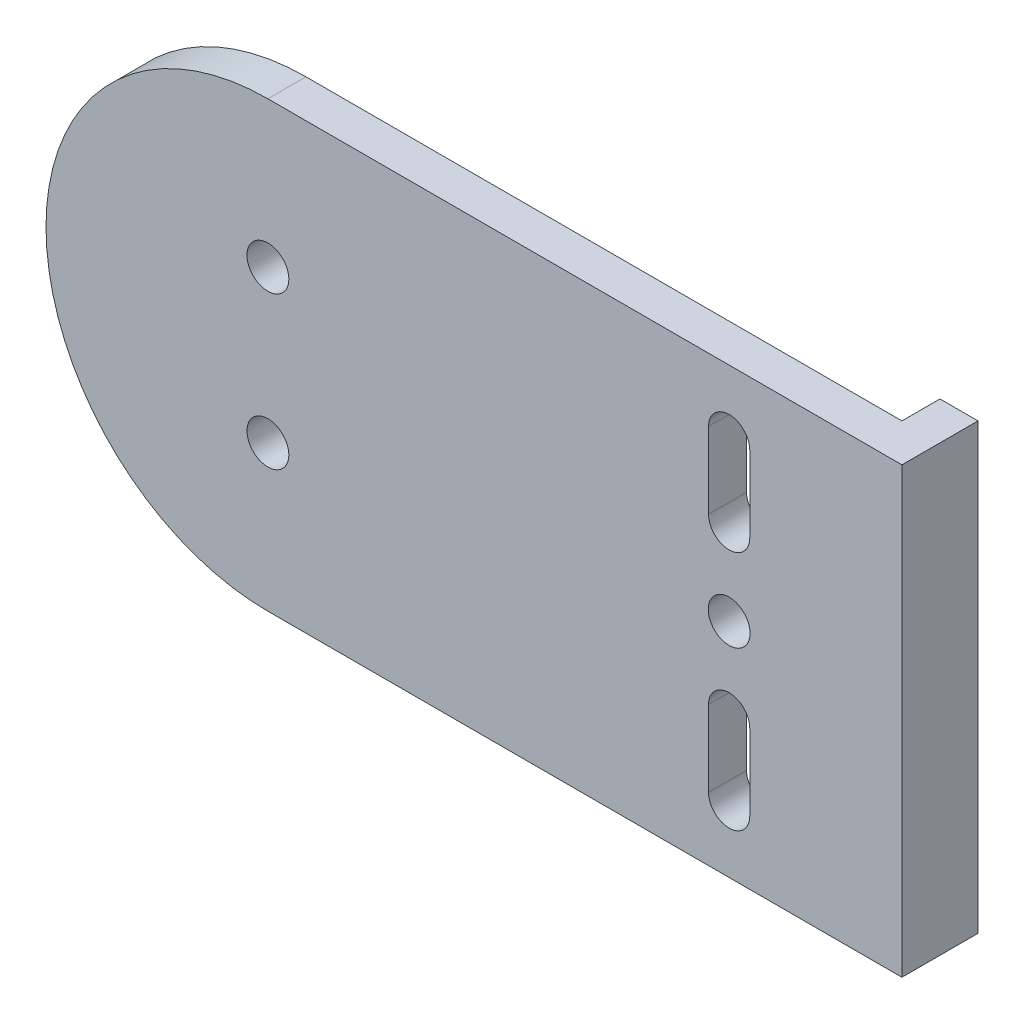
ISO-10303-21;
HEADER;
FILE_DESCRIPTION(('STEP AP214'),'2;1');
FILE_NAME('part.step','',(''),(''),'','','');
FILE_SCHEMA(('AUTOMOTIVE_DESIGN { 1 0 10303 214 1 1 1 1 }'));
ENDSEC;
DATA;
#1=APPLICATION_CONTEXT('core data for automotive mechanical design processes');
#2=APPLICATION_PROTOCOL_DEFINITION('international standard','automotive_design',2000,#1);
#3=PRODUCT_CONTEXT('',#1,'mechanical');
#4=PRODUCT('Part','Part','',(#3));
#5=PRODUCT_RELATED_PRODUCT_CATEGORY('part','',(#4));
#6=PRODUCT_DEFINITION_FORMATION('','',#4);
#7=PRODUCT_DEFINITION_CONTEXT('part definition',#1,'design');
#8=PRODUCT_DEFINITION('design','',#6,#7);
#9=PRODUCT_DEFINITION_SHAPE('','',#8);
#10=(LENGTH_UNIT() NAMED_UNIT(*) SI_UNIT(.MILLI.,.METRE.));
#11=(NAMED_UNIT(*) PLANE_ANGLE_UNIT() SI_UNIT($,.RADIAN.));
#12=(NAMED_UNIT(*) SI_UNIT($,.STERADIAN.) SOLID_ANGLE_UNIT());
#13=UNCERTAINTY_MEASURE_WITH_UNIT(LENGTH_MEASURE(1.E-05),#10,'distance_accuracy_value','');
#14=(GEOMETRIC_REPRESENTATION_CONTEXT(3) GLOBAL_UNCERTAINTY_ASSIGNED_CONTEXT((#13)) GLOBAL_UNIT_ASSIGNED_CONTEXT((#10,
#11,#12)) REPRESENTATION_CONTEXT('',''));
#15=CARTESIAN_POINT('',(0.,0.,0.));
#16=DIRECTION('',(0.,0.,1.));
#17=DIRECTION('',(1.,0.,0.));
#18=AXIS2_PLACEMENT_3D('',#15,#16,#17);
#19=CARTESIAN_POINT('',(0.,0.,3.));
#20=DIRECTION('',(0.,0.,1.));
#21=DIRECTION('',(1.,0.,0.));
#22=AXIS2_PLACEMENT_3D('',#19,#20,#21);
#23=PLANE('',#22);
#24=DIRECTION('',(1.,0.,0.));
#25=VECTOR('',#24,1.);
#26=CARTESIAN_POINT('',(50.,-17.5,3.));
#27=LINE('',#26,#25);
#28=CARTESIAN_POINT('',(0.,-17.5,3.));
#29=VERTEX_POINT('',#28);
#30=CARTESIAN_POINT('',(50.,-17.5,3.));
#31=VERTEX_POINT('',#30);
#32=EDGE_CURVE('E250',#29,#31,#27,.T.);
#33=ORIENTED_EDGE('',*,*,#32,.T.);
#34=DIRECTION('',(0.,1.,0.));
#35=VECTOR('',#34,1.);
#36=CARTESIAN_POINT('',(50.,17.5,3.));
#37=LINE('',#36,#35);
#38=CARTESIAN_POINT('',(50.,17.5,3.));
#39=VERTEX_POINT('',#38);
#40=EDGE_CURVE('E253',#31,#39,#37,.T.);
#41=ORIENTED_EDGE('',*,*,#40,.T.);
#42=DIRECTION('',(-1.,0.,0.));
#43=VECTOR('',#42,1.);
#44=CARTESIAN_POINT('',(0.,17.5,3.));
#45=LINE('',#44,#43);
#46=CARTESIAN_POINT('',(0.,17.5,3.));
#47=VERTEX_POINT('',#46);
#48=EDGE_CURVE('E139',#39,#47,#45,.T.);
#49=ORIENTED_EDGE('',*,*,#48,.T.);
#50=CARTESIAN_POINT('',(0.,0.,3.));
#51=DIRECTION('',(0.,0.,1.));
#52=DIRECTION('',(1.,0.,0.));
#53=AXIS2_PLACEMENT_3D('',#50,#51,#52);
#54=CIRCLE('',#53,17.5);
#55=EDGE_CURVE('E247',#47,#29,#54,.T.);
#56=ORIENTED_EDGE('',*,*,#55,.T.);
#57=EDGE_LOOP('',(#33,#41,#49,#56));
#58=FACE_BOUND('',#57,.T.);
#59=CARTESIAN_POINT('',(0.,6.,3.));
#60=DIRECTION('',(0.,0.,1.));
#61=DIRECTION('',(1.,0.,0.));
#62=AXIS2_PLACEMENT_3D('',#59,#60,#61);
#63=CIRCLE('',#62,1.65);
#64=CARTESIAN_POINT('',(1.65,6.,3.));
#65=VERTEX_POINT('',#64);
#66=EDGE_CURVE('E175',#65,#65,#63,.T.);
#67=ORIENTED_EDGE('',*,*,#66,.F.);
#68=EDGE_LOOP('',(#67));
#69=FACE_BOUND('',#68,.T.);
#70=DIRECTION('',(0.,-1.,0.));
#71=VECTOR('',#70,1.);
#72=CARTESIAN_POINT('',(34.75,-6.5,3.));
#73=LINE('',#72,#71);
#74=CARTESIAN_POINT('',(34.75,-6.5,3.));
#75=VERTEX_POINT('',#74);
#76=CARTESIAN_POINT('',(34.75,-12.5,3.));
#77=VERTEX_POINT('',#76);
#78=EDGE_CURVE('E189',#75,#77,#73,.T.);
#79=ORIENTED_EDGE('',*,*,#78,.F.);
#80=CARTESIAN_POINT('',(36.375,-6.5,3.));
#81=DIRECTION('',(0.,0.,1.));
#82=DIRECTION('',(1.,0.,0.));
#83=AXIS2_PLACEMENT_3D('',#80,#81,#82);
#84=CIRCLE('',#83,1.62499999999999);
#85=CARTESIAN_POINT('',(38.,-6.5,3.));
#86=VERTEX_POINT('',#85);
#87=EDGE_CURVE('E187',#86,#75,#84,.T.);
#88=ORIENTED_EDGE('',*,*,#87,.F.);
#89=DIRECTION('',(0.,1.,0.));
#90=VECTOR('',#89,1.);
#91=CARTESIAN_POINT('',(38.,-12.5,3.));
#92=LINE('',#91,#90);
#93=CARTESIAN_POINT('',(38.,-12.5,3.));
#94=VERTEX_POINT('',#93);
#95=EDGE_CURVE('E194',#94,#86,#92,.T.);
#96=ORIENTED_EDGE('',*,*,#95,.F.);
#97=CARTESIAN_POINT('',(36.375,-12.5,3.));
#98=DIRECTION('',(0.,0.,1.));
#99=DIRECTION('',(1.,0.,0.));
#100=AXIS2_PLACEMENT_3D('',#97,#98,#99);
#101=CIRCLE('',#100,1.625);
#102=EDGE_CURVE('E192',#77,#94,#101,.T.);
#103=ORIENTED_EDGE('',*,*,#102,.F.);
#104=EDGE_LOOP('',(#79,#88,#96,#103));
#105=FACE_BOUND('',#104,.T.);
#106=DIRECTION('',(0.,-1.,0.));
#107=VECTOR('',#106,1.);
#108=CARTESIAN_POINT('',(34.75,12.5,3.));
#109=LINE('',#108,#107);
#110=CARTESIAN_POINT('',(34.75,12.5,3.));
#111=VERTEX_POINT('',#110);
#112=CARTESIAN_POINT('',(34.75,6.49999999999999,3.));
#113=VERTEX_POINT('',#112);
#114=EDGE_CURVE('E218',#111,#113,#109,.T.);
#115=ORIENTED_EDGE('',*,*,#114,.F.);
#116=CARTESIAN_POINT('',(36.375,12.5,3.));
#117=DIRECTION('',(0.,0.,1.));
#118=DIRECTION('',(1.,0.,0.));
#119=AXIS2_PLACEMENT_3D('',#116,#117,#118);
#120=CIRCLE('',#119,1.625);
#121=CARTESIAN_POINT('',(38.,12.5,3.));
#122=VERTEX_POINT('',#121);
#123=EDGE_CURVE('E216',#122,#111,#120,.T.);
#124=ORIENTED_EDGE('',*,*,#123,.F.);
#125=DIRECTION('',(0.,1.,0.));
#126=VECTOR('',#125,1.);
#127=CARTESIAN_POINT('',(38.,6.49999999999999,3.));
#128=LINE('',#127,#126);
#129=CARTESIAN_POINT('',(38.,6.49999999999999,3.));
#130=VERTEX_POINT('',#129);
#131=EDGE_CURVE('E224',#130,#122,#128,.T.);
#132=ORIENTED_EDGE('',*,*,#131,.F.);
#133=CARTESIAN_POINT('',(36.375,6.49999999999999,3.));
#134=DIRECTION('',(0.,0.,1.));
#135=DIRECTION('',(1.,0.,0.));
#136=AXIS2_PLACEMENT_3D('',#133,#134,#135);
#137=CIRCLE('',#136,1.625);
#138=EDGE_CURVE('E221',#113,#130,#137,.T.);
#139=ORIENTED_EDGE('',*,*,#138,.F.);
#140=EDGE_LOOP('',(#115,#124,#132,#139));
#141=FACE_BOUND('',#140,.T.);
#142=CARTESIAN_POINT('',(36.375,0.,3.));
#143=DIRECTION('',(0.,0.,1.));
#144=DIRECTION('',(1.,0.,0.));
#145=AXIS2_PLACEMENT_3D('',#142,#143,#144);
#146=CIRCLE('',#145,1.65);
#147=CARTESIAN_POINT('',(38.025,0.,3.));
#148=VERTEX_POINT('',#147);
#149=EDGE_CURVE('E181',#148,#148,#146,.T.);
#150=ORIENTED_EDGE('',*,*,#149,.F.);
#151=EDGE_LOOP('',(#150));
#152=FACE_BOUND('',#151,.T.);
#153=CARTESIAN_POINT('',(0.,-6.,3.));
#154=DIRECTION('',(0.,0.,1.));
#155=DIRECTION('',(1.,0.,0.));
#156=AXIS2_PLACEMENT_3D('',#153,#154,#155);
#157=CIRCLE('',#156,1.65);
#158=CARTESIAN_POINT('',(1.65,-6.,3.));
#159=VERTEX_POINT('',#158);
#160=EDGE_CURVE('E169',#159,#159,#157,.T.);
#161=ORIENTED_EDGE('',*,*,#160,.F.);
#162=EDGE_LOOP('',(#161));
#163=FACE_BOUND('',#162,.T.);
#164=ADVANCED_FACE('F34',(#58,#69,#105,#141,#152,#163),#23,.T.);
#165=CARTESIAN_POINT('',(0.,0.,0.));
#166=DIRECTION('',(0.,0.,1.));
#167=DIRECTION('',(1.,0.,0.));
#168=AXIS2_PLACEMENT_3D('',#165,#166,#167);
#169=PLANE('',#168);
#170=CARTESIAN_POINT('',(36.375,12.5,0.));
#171=DIRECTION('',(0.,0.,1.));
#172=DIRECTION('',(1.,0.,0.));
#173=AXIS2_PLACEMENT_3D('',#170,#171,#172);
#174=CIRCLE('',#173,1.625);
#175=CARTESIAN_POINT('',(38.,12.5,0.));
#176=VERTEX_POINT('',#175);
#177=CARTESIAN_POINT('',(34.75,12.5,0.));
#178=VERTEX_POINT('',#177);
#179=EDGE_CURVE('E215',#176,#178,#174,.T.);
#180=ORIENTED_EDGE('',*,*,#179,.T.);
#181=DIRECTION('',(0.,-1.,0.));
#182=VECTOR('',#181,1.);
#183=CARTESIAN_POINT('',(34.75,12.5,0.));
#184=LINE('',#183,#182);
#185=CARTESIAN_POINT('',(34.75,6.49999999999999,0.));
#186=VERTEX_POINT('',#185);
#187=EDGE_CURVE('E229',#178,#186,#184,.T.);
#188=ORIENTED_EDGE('',*,*,#187,.T.);
#189=CARTESIAN_POINT('',(36.375,6.49999999999999,0.));
#190=DIRECTION('',(0.,0.,1.));
#191=DIRECTION('',(1.,0.,0.));
#192=AXIS2_PLACEMENT_3D('',#189,#190,#191);
#193=CIRCLE('',#192,1.625);
#194=CARTESIAN_POINT('',(38.,6.49999999999999,0.));
#195=VERTEX_POINT('',#194);
#196=EDGE_CURVE('E232',#186,#195,#193,.T.);
#197=ORIENTED_EDGE('',*,*,#196,.T.);
#198=DIRECTION('',(0.,1.,0.));
#199=VECTOR('',#198,1.);
#200=CARTESIAN_POINT('',(38.,6.49999999999999,0.));
#201=LINE('',#200,#199);
#202=EDGE_CURVE('E219',#195,#176,#201,.T.);
#203=ORIENTED_EDGE('',*,*,#202,.T.);
#204=EDGE_LOOP('',(#180,#188,#197,#203));
#205=FACE_BOUND('',#204,.T.);
#206=DIRECTION('',(-1.,0.,0.));
#207=VECTOR('',#206,1.);
#208=CARTESIAN_POINT('',(0.,17.5,0.));
#209=LINE('',#208,#207);
#210=CARTESIAN_POINT('',(47.,17.5,0.));
#211=VERTEX_POINT('',#210);
#212=CARTESIAN_POINT('',(0.,17.5,0.));
#213=VERTEX_POINT('',#212);
#214=EDGE_CURVE('E251',#211,#213,#209,.T.);
#215=ORIENTED_EDGE('',*,*,#214,.F.);
#216=DIRECTION('',(0.,-1.,0.));
#217=VECTOR('',#216,1.);
#218=CARTESIAN_POINT('',(47.,0.,0.));
#219=LINE('',#218,#217);
#220=CARTESIAN_POINT('',(47.,-17.5,0.));
#221=VERTEX_POINT('',#220);
#222=EDGE_CURVE('E164',#211,#221,#219,.T.);
#223=ORIENTED_EDGE('',*,*,#222,.T.);
#224=DIRECTION('',(1.,0.,0.));
#225=VECTOR('',#224,1.);
#226=CARTESIAN_POINT('',(50.,-17.5,0.));
#227=LINE('',#226,#225);
#228=CARTESIAN_POINT('',(0.,-17.5,0.));
#229=VERTEX_POINT('',#228);
#230=EDGE_CURVE('E258',#229,#221,#227,.T.);
#231=ORIENTED_EDGE('',*,*,#230,.F.);
#232=CARTESIAN_POINT('',(0.,0.,0.));
#233=DIRECTION('',(0.,0.,1.));
#234=DIRECTION('',(1.,0.,0.));
#235=AXIS2_PLACEMENT_3D('',#232,#233,#234);
#236=CIRCLE('',#235,17.5);
#237=EDGE_CURVE('E246',#213,#229,#236,.T.);
#238=ORIENTED_EDGE('',*,*,#237,.F.);
#239=EDGE_LOOP('',(#215,#223,#231,#238));
#240=FACE_BOUND('',#239,.T.);
#241=CARTESIAN_POINT('',(36.375,-6.5,0.));
#242=DIRECTION('',(0.,0.,1.));
#243=DIRECTION('',(1.,0.,0.));
#244=AXIS2_PLACEMENT_3D('',#241,#242,#243);
#245=CIRCLE('',#244,1.62499999999999);
#246=CARTESIAN_POINT('',(38.,-6.5,0.));
#247=VERTEX_POINT('',#246);
#248=CARTESIAN_POINT('',(34.75,-6.5,0.));
#249=VERTEX_POINT('',#248);
#250=EDGE_CURVE('E184',#247,#249,#245,.T.);
#251=ORIENTED_EDGE('',*,*,#250,.T.);
#252=DIRECTION('',(0.,-1.,0.));
#253=VECTOR('',#252,1.);
#254=CARTESIAN_POINT('',(34.75,-6.5,0.));
#255=LINE('',#254,#253);
#256=CARTESIAN_POINT('',(34.75,-12.5,0.));
#257=VERTEX_POINT('',#256);
#258=EDGE_CURVE('E199',#249,#257,#255,.T.);
#259=ORIENTED_EDGE('',*,*,#258,.T.);
#260=CARTESIAN_POINT('',(36.375,-12.5,0.));
#261=DIRECTION('',(0.,0.,1.));
#262=DIRECTION('',(1.,0.,0.));
#263=AXIS2_PLACEMENT_3D('',#260,#261,#262);
#264=CIRCLE('',#263,1.625);
#265=CARTESIAN_POINT('',(38.,-12.5,0.));
#266=VERTEX_POINT('',#265);
#267=EDGE_CURVE('E202',#257,#266,#264,.T.);
#268=ORIENTED_EDGE('',*,*,#267,.T.);
#269=DIRECTION('',(0.,1.,0.));
#270=VECTOR('',#269,1.);
#271=CARTESIAN_POINT('',(38.,-12.5,0.));
#272=LINE('',#271,#270);
#273=EDGE_CURVE('E190',#266,#247,#272,.T.);
#274=ORIENTED_EDGE('',*,*,#273,.T.);
#275=EDGE_LOOP('',(#251,#259,#268,#274));
#276=FACE_BOUND('',#275,.T.);
#277=CARTESIAN_POINT('',(36.375,0.,0.));
#278=DIRECTION('',(0.,0.,1.));
#279=DIRECTION('',(1.,0.,0.));
#280=AXIS2_PLACEMENT_3D('',#277,#278,#279);
#281=CIRCLE('',#280,1.65);
#282=CARTESIAN_POINT('',(38.025,0.,0.));
#283=VERTEX_POINT('',#282);
#284=EDGE_CURVE('E178',#283,#283,#281,.T.);
#285=ORIENTED_EDGE('',*,*,#284,.T.);
#286=EDGE_LOOP('',(#285));
#287=FACE_BOUND('',#286,.T.);
#288=CARTESIAN_POINT('',(0.,6.,0.));
#289=DIRECTION('',(0.,0.,1.));
#290=DIRECTION('',(1.,0.,0.));
#291=AXIS2_PLACEMENT_3D('',#288,#289,#290);
#292=CIRCLE('',#291,1.65);
#293=CARTESIAN_POINT('',(1.65,6.,0.));
#294=VERTEX_POINT('',#293);
#295=EDGE_CURVE('E172',#294,#294,#292,.T.);
#296=ORIENTED_EDGE('',*,*,#295,.T.);
#297=EDGE_LOOP('',(#296));
#298=FACE_BOUND('',#297,.T.);
#299=CARTESIAN_POINT('',(0.,-6.,0.));
#300=DIRECTION('',(0.,0.,1.));
#301=DIRECTION('',(1.,0.,0.));
#302=AXIS2_PLACEMENT_3D('',#299,#300,#301);
#303=CIRCLE('',#302,1.65);
#304=CARTESIAN_POINT('',(1.65,-6.,0.));
#305=VERTEX_POINT('',#304);
#306=EDGE_CURVE('E168',#305,#305,#303,.T.);
#307=ORIENTED_EDGE('',*,*,#306,.T.);
#308=EDGE_LOOP('',(#307));
#309=FACE_BOUND('',#308,.T.);
#310=ADVANCED_FACE('F269',(#205,#240,#276,#287,#298,#309),#169,.F.);
#311=CARTESIAN_POINT('',(0.,0.,3.));
#312=DIRECTION('',(0.,0.,-1.));
#313=DIRECTION('',(-1.,0.,0.));
#314=AXIS2_PLACEMENT_3D('',#311,#312,#313);
#315=CYLINDRICAL_SURFACE('',#314,17.5);
#316=ORIENTED_EDGE('',*,*,#237,.T.);
#317=DIRECTION('',(0.,0.,-1.));
#318=VECTOR('',#317,1.);
#319=CARTESIAN_POINT('',(0.,-17.5,3.));
#320=LINE('',#319,#318);
#321=EDGE_CURVE('E11',#29,#229,#320,.T.);
#322=ORIENTED_EDGE('',*,*,#321,.F.);
#323=ORIENTED_EDGE('',*,*,#55,.F.);
#324=DIRECTION('',(0.,0.,-1.));
#325=VECTOR('',#324,1.);
#326=CARTESIAN_POINT('',(0.,17.5,3.));
#327=LINE('',#326,#325);
#328=EDGE_CURVE('E143',#47,#213,#327,.T.);
#329=ORIENTED_EDGE('',*,*,#328,.T.);
#330=EDGE_LOOP('',(#316,#322,#323,#329));
#331=FACE_BOUND('',#330,.T.);
#332=ADVANCED_FACE('F36',(#331),#315,.T.);
#333=CARTESIAN_POINT('',(50.,-17.5,3.));
#334=DIRECTION('',(0.,1.,0.));
#335=DIRECTION('',(-1.,0.,0.));
#336=AXIS2_PLACEMENT_3D('',#333,#334,#335);
#337=PLANE('',#336);
#338=ORIENTED_EDGE('',*,*,#230,.T.);
#339=DIRECTION('',(0.,0.,1.));
#340=VECTOR('',#339,1.);
#341=CARTESIAN_POINT('',(47.,-17.5,-3.));
#342=LINE('',#341,#340);
#343=CARTESIAN_POINT('',(47.,-17.5,-3.));
#344=VERTEX_POINT('',#343);
#345=EDGE_CURVE('E162',#344,#221,#342,.T.);
#346=ORIENTED_EDGE('',*,*,#345,.F.);
#347=DIRECTION('',(1.,0.,0.));
#348=VECTOR('',#347,1.);
#349=CARTESIAN_POINT('',(50.,-17.5,-3.));
#350=LINE('',#349,#348);
#351=CARTESIAN_POINT('',(50.,-17.5,-3.));
#352=VERTEX_POINT('',#351);
#353=EDGE_CURVE('E160',#344,#352,#350,.T.);
#354=ORIENTED_EDGE('',*,*,#353,.T.);
#355=DIRECTION('',(0.,0.,-1.));
#356=VECTOR('',#355,1.);
#357=CARTESIAN_POINT('',(50.,-17.5,3.));
#358=LINE('',#357,#356);
#359=EDGE_CURVE('E42',#31,#352,#358,.T.);
#360=ORIENTED_EDGE('',*,*,#359,.F.);
#361=ORIENTED_EDGE('',*,*,#32,.F.);
#362=ORIENTED_EDGE('',*,*,#321,.T.);
#363=EDGE_LOOP('',(#338,#346,#354,#360,#361,#362));
#364=FACE_BOUND('',#363,.T.);
#365=ADVANCED_FACE('F272',(#364),#337,.F.);
#366=CARTESIAN_POINT('',(50.,17.5,3.));
#367=DIRECTION('',(-1.,0.,0.));
#368=DIRECTION('',(0.,0.,1.));
#369=AXIS2_PLACEMENT_3D('',#366,#367,#368);
#370=PLANE('',#369);
#371=ORIENTED_EDGE('',*,*,#359,.T.);
#372=DIRECTION('',(0.,1.,0.));
#373=VECTOR('',#372,1.);
#374=CARTESIAN_POINT('',(50.,17.5,-3.));
#375=LINE('',#374,#373);
#376=CARTESIAN_POINT('',(50.,17.5,-3.));
#377=VERTEX_POINT('',#376);
#378=EDGE_CURVE('E150',#352,#377,#375,.T.);
#379=ORIENTED_EDGE('',*,*,#378,.T.);
#380=DIRECTION('',(0.,0.,-1.));
#381=VECTOR('',#380,1.);
#382=CARTESIAN_POINT('',(50.,17.5,3.));
#383=LINE('',#382,#381);
#384=EDGE_CURVE('E134',#39,#377,#383,.T.);
#385=ORIENTED_EDGE('',*,*,#384,.F.);
#386=ORIENTED_EDGE('',*,*,#40,.F.);
#387=EDGE_LOOP('',(#371,#379,#385,#386));
#388=FACE_BOUND('',#387,.T.);
#389=ADVANCED_FACE('F155',(#388),#370,.F.);
#390=CARTESIAN_POINT('',(0.,17.5,3.));
#391=DIRECTION('',(0.,-1.,0.));
#392=DIRECTION('',(1.,0.,0.));
#393=AXIS2_PLACEMENT_3D('',#390,#391,#392);
#394=PLANE('',#393);
#395=ORIENTED_EDGE('',*,*,#328,.F.);
#396=ORIENTED_EDGE('',*,*,#48,.F.);
#397=ORIENTED_EDGE('',*,*,#384,.T.);
#398=DIRECTION('',(-1.,0.,0.));
#399=VECTOR('',#398,1.);
#400=CARTESIAN_POINT('',(50.,17.5,-3.));
#401=LINE('',#400,#399);
#402=CARTESIAN_POINT('',(47.,17.5,-3.));
#403=VERTEX_POINT('',#402);
#404=EDGE_CURVE('E138',#377,#403,#401,.T.);
#405=ORIENTED_EDGE('',*,*,#404,.T.);
#406=DIRECTION('',(0.,0.,1.));
#407=VECTOR('',#406,1.);
#408=CARTESIAN_POINT('',(47.,17.5,-3.));
#409=LINE('',#408,#407);
#410=EDGE_CURVE('E49',#403,#211,#409,.T.);
#411=ORIENTED_EDGE('',*,*,#410,.T.);
#412=ORIENTED_EDGE('',*,*,#214,.T.);
#413=EDGE_LOOP('',(#395,#396,#397,#405,#411,#412));
#414=FACE_BOUND('',#413,.T.);
#415=ADVANCED_FACE('F137',(#414),#394,.F.);
#416=CARTESIAN_POINT('',(36.375,12.5,3.));
#417=DIRECTION('',(0.,0.,-1.));
#418=DIRECTION('',(-1.,0.,0.));
#419=AXIS2_PLACEMENT_3D('',#416,#417,#418);
#420=CYLINDRICAL_SURFACE('',#419,1.625);
#421=ORIENTED_EDGE('',*,*,#179,.F.);
#422=DIRECTION('',(0.,0.,-1.));
#423=VECTOR('',#422,1.);
#424=CARTESIAN_POINT('',(38.,12.5,3.));
#425=LINE('',#424,#423);
#426=EDGE_CURVE('E226',#122,#176,#425,.T.);
#427=ORIENTED_EDGE('',*,*,#426,.F.);
#428=ORIENTED_EDGE('',*,*,#123,.T.);
#429=DIRECTION('',(0.,0.,-1.));
#430=VECTOR('',#429,1.);
#431=CARTESIAN_POINT('',(34.75,12.5,3.));
#432=LINE('',#431,#430);
#433=EDGE_CURVE('E243',#111,#178,#432,.T.);
#434=ORIENTED_EDGE('',*,*,#433,.T.);
#435=EDGE_LOOP('',(#421,#427,#428,#434));
#436=FACE_BOUND('',#435,.T.);
#437=ADVANCED_FACE('F309',(#436),#420,.F.);
#438=CARTESIAN_POINT('',(34.75,12.5,3.));
#439=DIRECTION('',(1.,0.,0.));
#440=DIRECTION('',(0.,1.,0.));
#441=AXIS2_PLACEMENT_3D('',#438,#439,#440);
#442=PLANE('',#441);
#443=ORIENTED_EDGE('',*,*,#187,.F.);
#444=ORIENTED_EDGE('',*,*,#433,.F.);
#445=ORIENTED_EDGE('',*,*,#114,.T.);
#446=DIRECTION('',(0.,0.,-1.));
#447=VECTOR('',#446,1.);
#448=CARTESIAN_POINT('',(34.75,6.49999999999999,3.));
#449=LINE('',#448,#447);
#450=EDGE_CURVE('E241',#113,#186,#449,.T.);
#451=ORIENTED_EDGE('',*,*,#450,.T.);
#452=EDGE_LOOP('',(#443,#444,#445,#451));
#453=FACE_BOUND('',#452,.T.);
#454=ADVANCED_FACE('F331',(#453),#442,.T.);
#455=CARTESIAN_POINT('',(36.375,6.49999999999999,3.));
#456=DIRECTION('',(0.,0.,-1.));
#457=DIRECTION('',(-1.,0.,0.));
#458=AXIS2_PLACEMENT_3D('',#455,#456,#457);
#459=CYLINDRICAL_SURFACE('',#458,1.625);
#460=ORIENTED_EDGE('',*,*,#196,.F.);
#461=ORIENTED_EDGE('',*,*,#450,.F.);
#462=ORIENTED_EDGE('',*,*,#138,.T.);
#463=DIRECTION('',(0.,0.,-1.));
#464=VECTOR('',#463,1.);
#465=CARTESIAN_POINT('',(38.,6.49999999999999,3.));
#466=LINE('',#465,#464);
#467=EDGE_CURVE('E239',#130,#195,#466,.T.);
#468=ORIENTED_EDGE('',*,*,#467,.T.);
#469=EDGE_LOOP('',(#460,#461,#462,#468));
#470=FACE_BOUND('',#469,.T.);
#471=ADVANCED_FACE('F338',(#470),#459,.F.);
#472=CARTESIAN_POINT('',(38.,6.49999999999999,3.));
#473=DIRECTION('',(-1.,0.,0.));
#474=DIRECTION('',(0.,0.,1.));
#475=AXIS2_PLACEMENT_3D('',#472,#473,#474);
#476=PLANE('',#475);
#477=ORIENTED_EDGE('',*,*,#202,.F.);
#478=ORIENTED_EDGE('',*,*,#467,.F.);
#479=ORIENTED_EDGE('',*,*,#131,.T.);
#480=ORIENTED_EDGE('',*,*,#426,.T.);
#481=EDGE_LOOP('',(#477,#478,#479,#480));
#482=FACE_BOUND('',#481,.T.);
#483=ADVANCED_FACE('F346',(#482),#476,.T.);
#484=CARTESIAN_POINT('',(36.375,-6.5,3.));
#485=DIRECTION('',(0.,0.,-1.));
#486=DIRECTION('',(-1.,0.,0.));
#487=AXIS2_PLACEMENT_3D('',#484,#485,#486);
#488=CYLINDRICAL_SURFACE('',#487,1.62499999999999);
#489=ORIENTED_EDGE('',*,*,#250,.F.);
#490=DIRECTION('',(0.,0.,-1.));
#491=VECTOR('',#490,1.);
#492=CARTESIAN_POINT('',(38.,-6.5,3.));
#493=LINE('',#492,#491);
#494=EDGE_CURVE('E196',#86,#247,#493,.T.);
#495=ORIENTED_EDGE('',*,*,#494,.F.);
#496=ORIENTED_EDGE('',*,*,#87,.T.);
#497=DIRECTION('',(0.,0.,-1.));
#498=VECTOR('',#497,1.);
#499=CARTESIAN_POINT('',(34.75,-6.5,3.));
#500=LINE('',#499,#498);
#501=EDGE_CURVE('E212',#75,#249,#500,.T.);
#502=ORIENTED_EDGE('',*,*,#501,.T.);
#503=EDGE_LOOP('',(#489,#495,#496,#502));
#504=FACE_BOUND('',#503,.T.);
#505=ADVANCED_FACE('F354',(#504),#488,.F.);
#506=CARTESIAN_POINT('',(34.75,-6.5,3.));
#507=DIRECTION('',(1.,0.,0.));
#508=DIRECTION('',(0.,1.,0.));
#509=AXIS2_PLACEMENT_3D('',#506,#507,#508);
#510=PLANE('',#509);
#511=ORIENTED_EDGE('',*,*,#258,.F.);
#512=ORIENTED_EDGE('',*,*,#501,.F.);
#513=ORIENTED_EDGE('',*,*,#78,.T.);
#514=DIRECTION('',(0.,0.,-1.));
#515=VECTOR('',#514,1.);
#516=CARTESIAN_POINT('',(34.75,-12.5,3.));
#517=LINE('',#516,#515);
#518=EDGE_CURVE('E210',#77,#257,#517,.T.);
#519=ORIENTED_EDGE('',*,*,#518,.T.);
#520=EDGE_LOOP('',(#511,#512,#513,#519));
#521=FACE_BOUND('',#520,.T.);
#522=ADVANCED_FACE('F362',(#521),#510,.T.);
#523=CARTESIAN_POINT('',(36.375,-12.5,3.));
#524=DIRECTION('',(0.,0.,-1.));
#525=DIRECTION('',(-1.,0.,0.));
#526=AXIS2_PLACEMENT_3D('',#523,#524,#525);
#527=CYLINDRICAL_SURFACE('',#526,1.625);
#528=ORIENTED_EDGE('',*,*,#267,.F.);
#529=ORIENTED_EDGE('',*,*,#518,.F.);
#530=ORIENTED_EDGE('',*,*,#102,.T.);
#531=DIRECTION('',(0.,0.,-1.));
#532=VECTOR('',#531,1.);
#533=CARTESIAN_POINT('',(38.,-12.5,3.));
#534=LINE('',#533,#532);
#535=EDGE_CURVE('E57',#94,#266,#534,.T.);
#536=ORIENTED_EDGE('',*,*,#535,.T.);
#537=EDGE_LOOP('',(#528,#529,#530,#536));
#538=FACE_BOUND('',#537,.T.);
#539=ADVANCED_FACE('F370',(#538),#527,.F.);
#540=CARTESIAN_POINT('',(38.,-12.5,3.));
#541=DIRECTION('',(-1.,0.,0.));
#542=DIRECTION('',(0.,-1.,0.));
#543=AXIS2_PLACEMENT_3D('',#540,#541,#542);
#544=PLANE('',#543);
#545=ORIENTED_EDGE('',*,*,#273,.F.);
#546=ORIENTED_EDGE('',*,*,#535,.F.);
#547=ORIENTED_EDGE('',*,*,#95,.T.);
#548=ORIENTED_EDGE('',*,*,#494,.T.);
#549=EDGE_LOOP('',(#545,#546,#547,#548));
#550=FACE_BOUND('',#549,.T.);
#551=ADVANCED_FACE('F378',(#550),#544,.T.);
#552=CARTESIAN_POINT('',(36.375,0.,3.));
#553=DIRECTION('',(0.,0.,-1.));
#554=DIRECTION('',(-1.,0.,0.));
#555=AXIS2_PLACEMENT_3D('',#552,#553,#554);
#556=CYLINDRICAL_SURFACE('',#555,1.65);
#557=ORIENTED_EDGE('',*,*,#149,.T.);
#558=EDGE_LOOP('',(#557));
#559=FACE_BOUND('',#558,.T.);
#560=ORIENTED_EDGE('',*,*,#284,.F.);
#561=EDGE_LOOP('',(#560));
#562=FACE_BOUND('',#561,.T.);
#563=ADVANCED_FACE('F386',(#559,#562),#556,.F.);
#564=CARTESIAN_POINT('',(0.,6.,3.));
#565=DIRECTION('',(0.,0.,-1.));
#566=DIRECTION('',(-1.,0.,0.));
#567=AXIS2_PLACEMENT_3D('',#564,#565,#566);
#568=CYLINDRICAL_SURFACE('',#567,1.65);
#569=ORIENTED_EDGE('',*,*,#66,.T.);
#570=EDGE_LOOP('',(#569));
#571=FACE_BOUND('',#570,.T.);
#572=ORIENTED_EDGE('',*,*,#295,.F.);
#573=EDGE_LOOP('',(#572));
#574=FACE_BOUND('',#573,.T.);
#575=ADVANCED_FACE('F295',(#571,#574),#568,.F.);
#576=CARTESIAN_POINT('',(0.,-6.,3.));
#577=DIRECTION('',(0.,0.,-1.));
#578=DIRECTION('',(-1.,0.,0.));
#579=AXIS2_PLACEMENT_3D('',#576,#577,#578);
#580=CYLINDRICAL_SURFACE('',#579,1.65);
#581=ORIENTED_EDGE('',*,*,#160,.T.);
#582=EDGE_LOOP('',(#581));
#583=FACE_BOUND('',#582,.T.);
#584=ORIENTED_EDGE('',*,*,#306,.F.);
#585=EDGE_LOOP('',(#584));
#586=FACE_BOUND('',#585,.T.);
#587=ADVANCED_FACE('F291',(#583,#586),#580,.F.);
#588=CARTESIAN_POINT('',(47.,17.5,-3.));
#589=DIRECTION('',(-1.,0.,0.));
#590=DIRECTION('',(0.,-1.,0.));
#591=AXIS2_PLACEMENT_3D('',#588,#589,#590);
#592=PLANE('',#591);
#593=ORIENTED_EDGE('',*,*,#222,.F.);
#594=ORIENTED_EDGE('',*,*,#410,.F.);
#595=DIRECTION('',(0.,-1.,0.));
#596=VECTOR('',#595,1.);
#597=CARTESIAN_POINT('',(47.,17.5,-3.));
#598=LINE('',#597,#596);
#599=EDGE_CURVE('E153',#403,#344,#598,.T.);
#600=ORIENTED_EDGE('',*,*,#599,.T.);
#601=ORIENTED_EDGE('',*,*,#345,.T.);
#602=EDGE_LOOP('',(#593,#594,#600,#601));
#603=FACE_BOUND('',#602,.T.);
#604=ADVANCED_FACE('F294',(#603),#592,.T.);
#605=CARTESIAN_POINT('',(0.,0.,-3.));
#606=DIRECTION('',(0.,0.,-1.));
#607=DIRECTION('',(-1.,0.,0.));
#608=AXIS2_PLACEMENT_3D('',#605,#606,#607);
#609=PLANE('',#608);
#610=ORIENTED_EDGE('',*,*,#378,.F.);
#611=ORIENTED_EDGE('',*,*,#353,.F.);
#612=ORIENTED_EDGE('',*,*,#599,.F.);
#613=ORIENTED_EDGE('',*,*,#404,.F.);
#614=EDGE_LOOP('',(#610,#611,#612,#613));
#615=FACE_BOUND('',#614,.T.);
#616=ADVANCED_FACE('F148',(#615),#609,.T.);
#617=CLOSED_SHELL('',(#164,#310,#332,#365,#389,#415,#437,#454,#471,#483,#505,#522,#539,#551,
#563,#575,#587,#604,#616));
#618=MANIFOLD_SOLID_BREP('B2',#617);
#619=ADVANCED_BREP_SHAPE_REPRESENTATION('',(#18,#618),#14);
#620=SHAPE_DEFINITION_REPRESENTATION(#9,#619);
ENDSEC;
END-ISO-10303-21;
